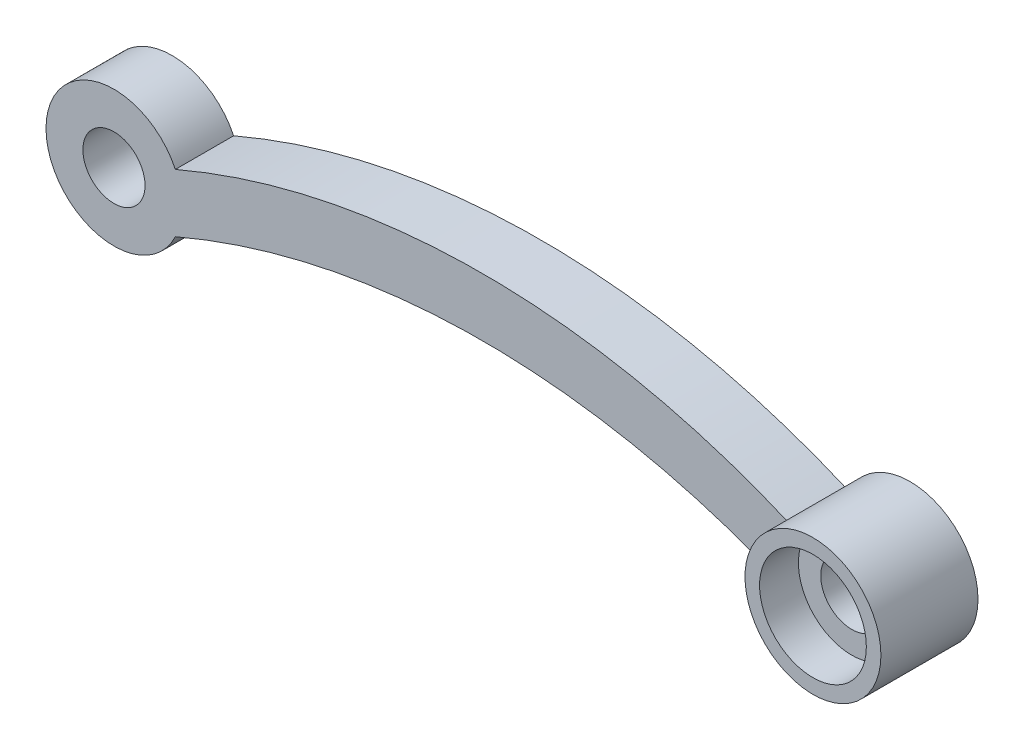
ISO-10303-21;
HEADER;
FILE_DESCRIPTION(('STEP AP214'),'2;1');
FILE_NAME('part.step','',(''),(''),'','','');
FILE_SCHEMA(('AUTOMOTIVE_DESIGN { 1 0 10303 214 1 1 1 1 }'));
ENDSEC;
DATA;
#1=APPLICATION_CONTEXT('core data for automotive mechanical design processes');
#2=APPLICATION_PROTOCOL_DEFINITION('international standard','automotive_design',2000,#1);
#3=PRODUCT_CONTEXT('',#1,'mechanical');
#4=PRODUCT('Part','Part','',(#3));
#5=PRODUCT_RELATED_PRODUCT_CATEGORY('part','',(#4));
#6=PRODUCT_DEFINITION_FORMATION('','',#4);
#7=PRODUCT_DEFINITION_CONTEXT('part definition',#1,'design');
#8=PRODUCT_DEFINITION('design','',#6,#7);
#9=PRODUCT_DEFINITION_SHAPE('','',#8);
#10=(LENGTH_UNIT() NAMED_UNIT(*) SI_UNIT(.MILLI.,.METRE.));
#11=(NAMED_UNIT(*) PLANE_ANGLE_UNIT() SI_UNIT($,.RADIAN.));
#12=(NAMED_UNIT(*) SI_UNIT($,.STERADIAN.) SOLID_ANGLE_UNIT());
#13=UNCERTAINTY_MEASURE_WITH_UNIT(LENGTH_MEASURE(1.E-05),#10,'distance_accuracy_value','');
#14=(GEOMETRIC_REPRESENTATION_CONTEXT(3) GLOBAL_UNCERTAINTY_ASSIGNED_CONTEXT((#13)) GLOBAL_UNIT_ASSIGNED_CONTEXT((#10,
#11,#12)) REPRESENTATION_CONTEXT('',''));
#15=CARTESIAN_POINT('',(0.,0.,0.));
#16=DIRECTION('',(0.,0.,1.));
#17=DIRECTION('',(1.,0.,0.));
#18=AXIS2_PLACEMENT_3D('',#15,#16,#17);
#19=CARTESIAN_POINT('',(0.,0.,3.));
#20=DIRECTION('',(0.,0.,1.));
#21=DIRECTION('',(1.,0.,0.));
#22=AXIS2_PLACEMENT_3D('',#19,#20,#21);
#23=PLANE('',#22);
#24=CARTESIAN_POINT('',(19.,0.,3.));
#25=DIRECTION('',(0.,0.,1.));
#26=DIRECTION('',(1.,0.,0.));
#27=AXIS2_PLACEMENT_3D('',#24,#25,#26);
#28=CIRCLE('',#27,1.6);
#29=CARTESIAN_POINT('',(20.6,0.,3.));
#30=VERTEX_POINT('',#29);
#31=EDGE_CURVE('E144',#30,#30,#28,.F.);
#32=ORIENTED_EDGE('',*,*,#31,.T.);
#33=EDGE_LOOP('',(#32));
#34=FACE_BOUND('',#33,.T.);
#35=CARTESIAN_POINT('',(19.,0.,3.));
#36=DIRECTION('',(0.,0.,1.));
#37=DIRECTION('',(1.,0.,0.));
#38=AXIS2_PLACEMENT_3D('',#35,#36,#37);
#39=CIRCLE('',#38,2.74999999999999);
#40=CARTESIAN_POINT('',(21.75,0.,3.));
#41=VERTEX_POINT('',#40);
#42=EDGE_CURVE('E165',#41,#41,#39,.T.);
#43=ORIENTED_EDGE('',*,*,#42,.T.);
#44=EDGE_LOOP('',(#43));
#45=FACE_BOUND('',#44,.T.);
#46=ADVANCED_FACE('F49',(#34,#45),#23,.T.);
#47=CARTESIAN_POINT('',(-19.,0.,3.));
#48=DIRECTION('',(0.,0.,-1.));
#49=DIRECTION('',(-1.,0.,0.));
#50=AXIS2_PLACEMENT_3D('',#47,#48,#49);
#51=CYLINDRICAL_SURFACE('',#50,3.5);
#52=CARTESIAN_POINT('',(-19.,0.,0.));
#53=DIRECTION('',(0.,0.,1.));
#54=DIRECTION('',(1.,0.,0.));
#55=AXIS2_PLACEMENT_3D('',#52,#53,#54);
#56=CIRCLE('',#55,3.5);
#57=CARTESIAN_POINT('',(-15.8377223398316,1.5,0.));
#58=VERTEX_POINT('',#57);
#59=CARTESIAN_POINT('',(-15.8377223398316,-1.5,0.));
#60=VERTEX_POINT('',#59);
#61=EDGE_CURVE('E133',#58,#60,#56,.T.);
#62=ORIENTED_EDGE('',*,*,#61,.T.);
#63=DIRECTION('',(0.,0.,-1.));
#64=VECTOR('',#63,1.);
#65=CARTESIAN_POINT('',(-15.8377223398316,-1.5,3.));
#66=LINE('',#65,#64);
#67=CARTESIAN_POINT('',(-15.8377223398316,-1.5,3.));
#68=VERTEX_POINT('',#67);
#69=EDGE_CURVE('E11',#68,#60,#66,.T.);
#70=ORIENTED_EDGE('',*,*,#69,.F.);
#71=CARTESIAN_POINT('',(-19.,0.,3.));
#72=DIRECTION('',(0.,0.,1.));
#73=DIRECTION('',(1.,0.,0.));
#74=AXIS2_PLACEMENT_3D('',#71,#72,#73);
#75=CIRCLE('',#74,3.5);
#76=CARTESIAN_POINT('',(-15.8377223398316,1.5,3.));
#77=VERTEX_POINT('',#76);
#78=EDGE_CURVE('E121',#77,#68,#75,.T.);
#79=ORIENTED_EDGE('',*,*,#78,.F.);
#80=DIRECTION('',(0.,0.,-1.));
#81=VECTOR('',#80,1.);
#82=CARTESIAN_POINT('',(-15.8377223398316,1.5,3.));
#83=LINE('',#82,#81);
#84=EDGE_CURVE('E67',#77,#58,#83,.T.);
#85=ORIENTED_EDGE('',*,*,#84,.T.);
#86=EDGE_LOOP('',(#62,#70,#79,#85));
#87=FACE_BOUND('',#86,.T.);
#88=ADVANCED_FACE('F151',(#87),#51,.T.);
#89=CARTESIAN_POINT('',(0.,-38.2310025875472,3.));
#90=DIRECTION('',(0.,0.,-1.));
#91=DIRECTION('',(-1.,0.,0.));
#92=AXIS2_PLACEMENT_3D('',#89,#90,#91);
#93=CYLINDRICAL_SURFACE('',#92,40.);
#94=CARTESIAN_POINT('',(0.,-38.2310025875472,0.));
#95=DIRECTION('',(0.,0.,1.));
#96=DIRECTION('',(1.,0.,0.));
#97=AXIS2_PLACEMENT_3D('',#94,#95,#96);
#98=CIRCLE('',#97,40.);
#99=CARTESIAN_POINT('',(15.8377223398316,-1.5,0.));
#100=VERTEX_POINT('',#99);
#101=EDGE_CURVE('E136',#60,#100,#98,.F.);
#102=ORIENTED_EDGE('',*,*,#101,.T.);
#103=DIRECTION('',(0.,0.,-1.));
#104=VECTOR('',#103,1.);
#105=CARTESIAN_POINT('',(15.8377223398316,-1.5,3.));
#106=LINE('',#105,#104);
#107=CARTESIAN_POINT('',(15.8377223398316,-1.5,3.));
#108=VERTEX_POINT('',#107);
#109=EDGE_CURVE('E59',#108,#100,#106,.T.);
#110=ORIENTED_EDGE('',*,*,#109,.F.);
#111=CARTESIAN_POINT('',(0.,-38.2310025875472,3.));
#112=DIRECTION('',(0.,0.,1.));
#113=DIRECTION('',(1.,0.,0.));
#114=AXIS2_PLACEMENT_3D('',#111,#112,#113);
#115=CIRCLE('',#114,40.);
#116=EDGE_CURVE('E92',#68,#108,#115,.F.);
#117=ORIENTED_EDGE('',*,*,#116,.F.);
#118=ORIENTED_EDGE('',*,*,#69,.T.);
#119=EDGE_LOOP('',(#102,#110,#117,#118));
#120=FACE_BOUND('',#119,.T.);
#121=ADVANCED_FACE('F147',(#120),#93,.F.);
#122=CARTESIAN_POINT('',(19.,0.,3.));
#123=DIRECTION('',(0.,0.,-1.));
#124=DIRECTION('',(-1.,0.,0.));
#125=AXIS2_PLACEMENT_3D('',#122,#123,#124);
#126=CYLINDRICAL_SURFACE('',#125,3.5);
#127=CARTESIAN_POINT('',(19.,0.,0.));
#128=DIRECTION('',(0.,0.,1.));
#129=DIRECTION('',(1.,0.,0.));
#130=AXIS2_PLACEMENT_3D('',#127,#128,#129);
#131=CIRCLE('',#130,3.5);
#132=CARTESIAN_POINT('',(15.8377223398316,1.5,0.));
#133=VERTEX_POINT('',#132);
#134=EDGE_CURVE('E110',#133,#100,#131,.F.);
#135=ORIENTED_EDGE('',*,*,#134,.F.);
#136=DIRECTION('',(0.,0.,-1.));
#137=VECTOR('',#136,1.);
#138=CARTESIAN_POINT('',(15.8377223398316,1.5,3.));
#139=LINE('',#138,#137);
#140=CARTESIAN_POINT('',(15.8377223398316,1.5,3.));
#141=VERTEX_POINT('',#140);
#142=EDGE_CURVE('E83',#141,#133,#139,.T.);
#143=ORIENTED_EDGE('',*,*,#142,.F.);
#144=CARTESIAN_POINT('',(19.,0.,3.));
#145=DIRECTION('',(0.,0.,1.));
#146=DIRECTION('',(1.,0.,0.));
#147=AXIS2_PLACEMENT_3D('',#144,#145,#146);
#148=CIRCLE('',#147,3.50000000000001);
#149=EDGE_CURVE('E98',#141,#108,#148,.T.);
#150=ORIENTED_EDGE('',*,*,#149,.T.);
#151=ORIENTED_EDGE('',*,*,#109,.T.);
#152=EDGE_LOOP('',(#135,#143,#150,#151));
#153=FACE_BOUND('',#152,.T.);
#154=CARTESIAN_POINT('',(19.,0.,5.));
#155=DIRECTION('',(0.,0.,1.));
#156=DIRECTION('',(1.,0.,0.));
#157=AXIS2_PLACEMENT_3D('',#154,#155,#156);
#158=CIRCLE('',#157,3.50000000000001);
#159=CARTESIAN_POINT('',(22.5,0.,5.));
#160=VERTEX_POINT('',#159);
#161=EDGE_CURVE('E104',#160,#160,#158,.T.);
#162=ORIENTED_EDGE('',*,*,#161,.F.);
#163=EDGE_LOOP('',(#162));
#164=FACE_BOUND('',#163,.T.);
#165=ADVANCED_FACE('F107',(#153,#164),#126,.T.);
#166=CARTESIAN_POINT('',(-19.,0.,3.));
#167=DIRECTION('',(0.,0.,-1.));
#168=DIRECTION('',(-1.,0.,0.));
#169=AXIS2_PLACEMENT_3D('',#166,#167,#168);
#170=CYLINDRICAL_SURFACE('',#169,1.6);
#171=CARTESIAN_POINT('',(-19.,0.,3.));
#172=DIRECTION('',(0.,0.,1.));
#173=DIRECTION('',(1.,0.,0.));
#174=AXIS2_PLACEMENT_3D('',#171,#172,#173);
#175=CIRCLE('',#174,1.6);
#176=CARTESIAN_POINT('',(-17.4,0.,3.));
#177=VERTEX_POINT('',#176);
#178=EDGE_CURVE('E153',#177,#177,#175,.T.);
#179=ORIENTED_EDGE('',*,*,#178,.T.);
#180=EDGE_LOOP('',(#179));
#181=FACE_BOUND('',#180,.T.);
#182=CARTESIAN_POINT('',(-19.,0.,0.));
#183=DIRECTION('',(0.,0.,1.));
#184=DIRECTION('',(1.,0.,0.));
#185=AXIS2_PLACEMENT_3D('',#182,#183,#184);
#186=CIRCLE('',#185,1.6);
#187=CARTESIAN_POINT('',(-17.4,0.,0.));
#188=VERTEX_POINT('',#187);
#189=EDGE_CURVE('E129',#188,#188,#186,.T.);
#190=ORIENTED_EDGE('',*,*,#189,.F.);
#191=EDGE_LOOP('',(#190));
#192=FACE_BOUND('',#191,.T.);
#193=ADVANCED_FACE('F206',(#181,#192),#170,.F.);
#194=CARTESIAN_POINT('',(19.,0.,3.));
#195=DIRECTION('',(0.,0.,-1.));
#196=DIRECTION('',(-1.,0.,0.));
#197=AXIS2_PLACEMENT_3D('',#194,#195,#196);
#198=CYLINDRICAL_SURFACE('',#197,1.6);
#199=ORIENTED_EDGE('',*,*,#31,.F.);
#200=EDGE_LOOP('',(#199));
#201=FACE_BOUND('',#200,.T.);
#202=CARTESIAN_POINT('',(19.,0.,0.));
#203=DIRECTION('',(0.,0.,1.));
#204=DIRECTION('',(1.,0.,0.));
#205=AXIS2_PLACEMENT_3D('',#202,#203,#204);
#206=CIRCLE('',#205,1.6);
#207=CARTESIAN_POINT('',(20.6,0.,0.));
#208=VERTEX_POINT('',#207);
#209=EDGE_CURVE('E125',#208,#208,#206,.F.);
#210=ORIENTED_EDGE('',*,*,#209,.T.);
#211=EDGE_LOOP('',(#210));
#212=FACE_BOUND('',#211,.T.);
#213=ADVANCED_FACE('F51',(#201,#212),#198,.F.);
#214=CARTESIAN_POINT('',(0.,-35.2310025875472,3.));
#215=DIRECTION('',(0.,0.,-1.));
#216=DIRECTION('',(-1.,0.,0.));
#217=AXIS2_PLACEMENT_3D('',#214,#215,#216);
#218=CYLINDRICAL_SURFACE('',#217,40.);
#219=CARTESIAN_POINT('',(0.,-35.2310025875472,0.));
#220=DIRECTION('',(0.,0.,1.));
#221=DIRECTION('',(1.,0.,0.));
#222=AXIS2_PLACEMENT_3D('',#219,#220,#221);
#223=CIRCLE('',#222,40.);
#224=EDGE_CURVE('E142',#58,#133,#223,.F.);
#225=ORIENTED_EDGE('',*,*,#224,.F.);
#226=ORIENTED_EDGE('',*,*,#84,.F.);
#227=CARTESIAN_POINT('',(0.,-35.2310025875472,3.));
#228=DIRECTION('',(0.,0.,1.));
#229=DIRECTION('',(1.,0.,0.));
#230=AXIS2_PLACEMENT_3D('',#227,#228,#229);
#231=CIRCLE('',#230,40.);
#232=EDGE_CURVE('E101',#77,#141,#231,.F.);
#233=ORIENTED_EDGE('',*,*,#232,.T.);
#234=ORIENTED_EDGE('',*,*,#142,.T.);
#235=EDGE_LOOP('',(#225,#226,#233,#234));
#236=FACE_BOUND('',#235,.T.);
#237=ADVANCED_FACE('F114',(#236),#218,.T.);
#238=ORIENTED_EDGE('',*,*,#149,.F.);
#239=ORIENTED_EDGE('',*,*,#232,.F.);
#240=ORIENTED_EDGE('',*,*,#78,.T.);
#241=ORIENTED_EDGE('',*,*,#116,.T.);
#242=EDGE_LOOP('',(#238,#239,#240,#241));
#243=FACE_BOUND('',#242,.T.);
#244=ORIENTED_EDGE('',*,*,#178,.F.);
#245=EDGE_LOOP('',(#244));
#246=FACE_BOUND('',#245,.T.);
#247=ADVANCED_FACE('F99',(#243,#246),#23,.T.);
#248=CARTESIAN_POINT('',(0.,0.,0.));
#249=DIRECTION('',(0.,0.,1.));
#250=DIRECTION('',(1.,0.,0.));
#251=AXIS2_PLACEMENT_3D('',#248,#249,#250);
#252=PLANE('',#251);
#253=ORIENTED_EDGE('',*,*,#209,.F.);
#254=EDGE_LOOP('',(#253));
#255=FACE_BOUND('',#254,.T.);
#256=ORIENTED_EDGE('',*,*,#189,.T.);
#257=EDGE_LOOP('',(#256));
#258=FACE_BOUND('',#257,.T.);
#259=ORIENTED_EDGE('',*,*,#61,.F.);
#260=ORIENTED_EDGE('',*,*,#224,.T.);
#261=ORIENTED_EDGE('',*,*,#134,.T.);
#262=ORIENTED_EDGE('',*,*,#101,.F.);
#263=EDGE_LOOP('',(#259,#260,#261,#262));
#264=FACE_BOUND('',#263,.T.);
#265=ADVANCED_FACE('F150',(#255,#258,#264),#252,.F.);
#266=CARTESIAN_POINT('',(19.,0.,5.));
#267=DIRECTION('',(0.,0.,1.));
#268=DIRECTION('',(1.,0.,0.));
#269=AXIS2_PLACEMENT_3D('',#266,#267,#268);
#270=PLANE('',#269);
#271=ORIENTED_EDGE('',*,*,#161,.T.);
#272=EDGE_LOOP('',(#271));
#273=FACE_BOUND('',#272,.T.);
#274=CARTESIAN_POINT('',(19.,0.,5.));
#275=DIRECTION('',(0.,0.,1.));
#276=DIRECTION('',(1.,0.,0.));
#277=AXIS2_PLACEMENT_3D('',#274,#275,#276);
#278=CIRCLE('',#277,2.74999999999999);
#279=CARTESIAN_POINT('',(21.75,0.,5.));
#280=VERTEX_POINT('',#279);
#281=EDGE_CURVE('E105',#280,#280,#278,.T.);
#282=ORIENTED_EDGE('',*,*,#281,.F.);
#283=EDGE_LOOP('',(#282));
#284=FACE_BOUND('',#283,.T.);
#285=ADVANCED_FACE('F177',(#273,#284),#270,.T.);
#286=CARTESIAN_POINT('',(19.,0.,5.));
#287=DIRECTION('',(0.,0.,-1.));
#288=DIRECTION('',(-1.,0.,0.));
#289=AXIS2_PLACEMENT_3D('',#286,#287,#288);
#290=CYLINDRICAL_SURFACE('',#289,2.74999999999999);
#291=ORIENTED_EDGE('',*,*,#281,.T.);
#292=EDGE_LOOP('',(#291));
#293=FACE_BOUND('',#292,.T.);
#294=ORIENTED_EDGE('',*,*,#42,.F.);
#295=EDGE_LOOP('',(#294));
#296=FACE_BOUND('',#295,.T.);
#297=ADVANCED_FACE('F174',(#293,#296),#290,.F.);
#298=CLOSED_SHELL('',(#46,#88,#121,#165,#193,#213,#237,#247,#265,#285,#297));
#299=MANIFOLD_SOLID_BREP('B2',#298);
#300=ADVANCED_BREP_SHAPE_REPRESENTATION('',(#18,#299),#14);
#301=SHAPE_DEFINITION_REPRESENTATION(#9,#300);
ENDSEC;
END-ISO-10303-21;
